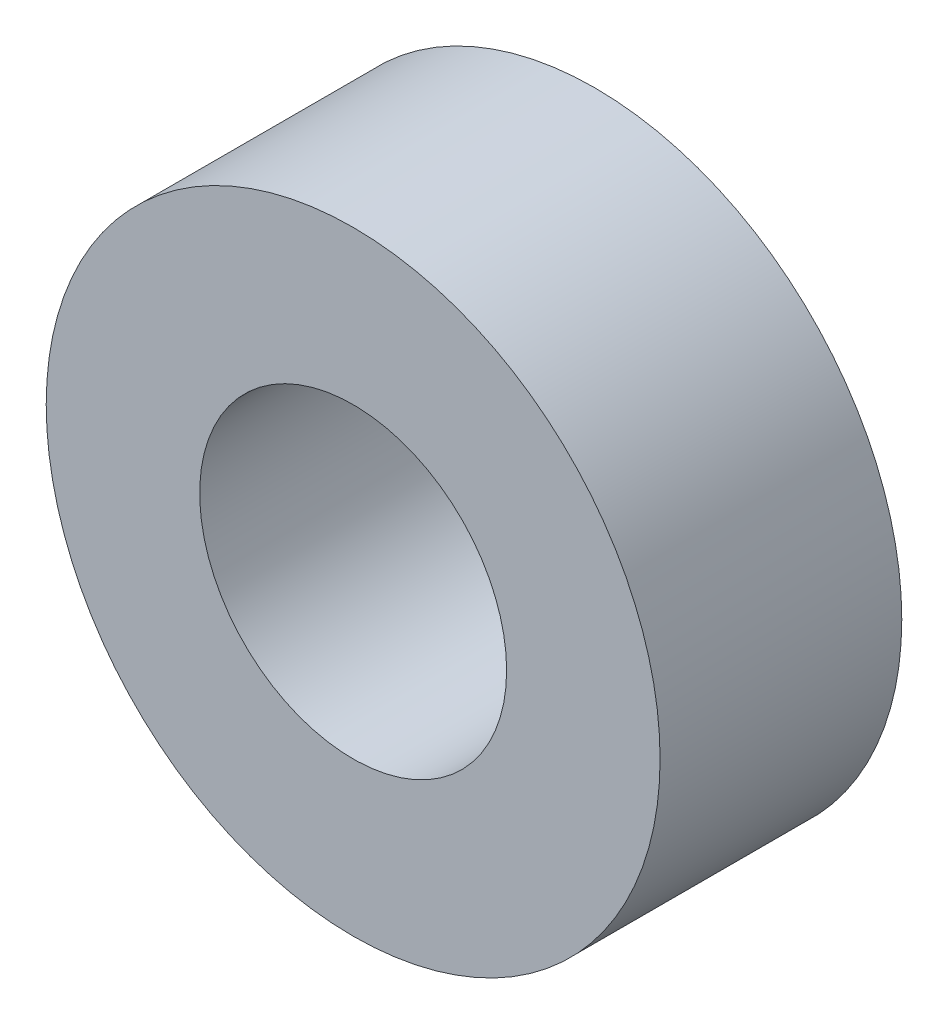
ISO-10303-21;
HEADER;
FILE_DESCRIPTION(('STEP AP214'),'2;1');
FILE_NAME('part.step','',(''),(''),'','','');
FILE_SCHEMA(('AUTOMOTIVE_DESIGN { 1 0 10303 214 1 1 1 1 }'));
ENDSEC;
DATA;
#1=APPLICATION_CONTEXT('core data for automotive mechanical design processes');
#2=APPLICATION_PROTOCOL_DEFINITION('international standard','automotive_design',2000,#1);
#3=PRODUCT_CONTEXT('',#1,'mechanical');
#4=PRODUCT('Part','Part','',(#3));
#5=PRODUCT_RELATED_PRODUCT_CATEGORY('part','',(#4));
#6=PRODUCT_DEFINITION_FORMATION('','',#4);
#7=PRODUCT_DEFINITION_CONTEXT('part definition',#1,'design');
#8=PRODUCT_DEFINITION('design','',#6,#7);
#9=PRODUCT_DEFINITION_SHAPE('','',#8);
#10=(LENGTH_UNIT() NAMED_UNIT(*) SI_UNIT(.MILLI.,.METRE.));
#11=(NAMED_UNIT(*) PLANE_ANGLE_UNIT() SI_UNIT($,.RADIAN.));
#12=(NAMED_UNIT(*) SI_UNIT($,.STERADIAN.) SOLID_ANGLE_UNIT());
#13=UNCERTAINTY_MEASURE_WITH_UNIT(LENGTH_MEASURE(1.E-05),#10,'distance_accuracy_value','');
#14=(GEOMETRIC_REPRESENTATION_CONTEXT(3) GLOBAL_UNCERTAINTY_ASSIGNED_CONTEXT((#13)) GLOBAL_UNIT_ASSIGNED_CONTEXT((#10,
#11,#12)) REPRESENTATION_CONTEXT('',''));
#15=CARTESIAN_POINT('',(0.,0.,0.));
#16=DIRECTION('',(0.,0.,1.));
#17=DIRECTION('',(1.,0.,0.));
#18=AXIS2_PLACEMENT_3D('',#15,#16,#17);
#19=CARTESIAN_POINT('',(0.,0.,5.));
#20=DIRECTION('',(0.,0.,1.));
#21=DIRECTION('',(1.,0.,0.));
#22=AXIS2_PLACEMENT_3D('',#19,#20,#21);
#23=PLANE('',#22);
#24=CARTESIAN_POINT('',(0.,0.,5.));
#25=DIRECTION('',(0.,0.,1.));
#26=DIRECTION('',(1.,0.,0.));
#27=AXIS2_PLACEMENT_3D('',#24,#25,#26);
#28=CIRCLE('',#27,6.35);
#29=CARTESIAN_POINT('',(6.35,0.,5.));
#30=VERTEX_POINT('',#29);
#31=EDGE_CURVE('E10',#30,#30,#28,.T.);
#32=ORIENTED_EDGE('',*,*,#31,.T.);
#33=EDGE_LOOP('',(#32));
#34=FACE_BOUND('',#33,.T.);
#35=CARTESIAN_POINT('',(0.,0.,5.));
#36=DIRECTION('',(0.,0.,1.));
#37=DIRECTION('',(1.,0.,0.));
#38=AXIS2_PLACEMENT_3D('',#35,#36,#37);
#39=CIRCLE('',#38,3.175);
#40=CARTESIAN_POINT('',(3.175,0.,5.));
#41=VERTEX_POINT('',#40);
#42=EDGE_CURVE('E42',#41,#41,#39,.T.);
#43=ORIENTED_EDGE('',*,*,#42,.F.);
#44=EDGE_LOOP('',(#43));
#45=FACE_BOUND('',#44,.T.);
#46=ADVANCED_FACE('F31',(#34,#45),#23,.T.);
#47=CARTESIAN_POINT('',(0.,0.,0.));
#48=DIRECTION('',(0.,0.,1.));
#49=DIRECTION('',(1.,0.,0.));
#50=AXIS2_PLACEMENT_3D('',#47,#48,#49);
#51=PLANE('',#50);
#52=CARTESIAN_POINT('',(0.,0.,0.));
#53=DIRECTION('',(0.,0.,1.));
#54=DIRECTION('',(1.,0.,0.));
#55=AXIS2_PLACEMENT_3D('',#52,#53,#54);
#56=CIRCLE('',#55,6.35);
#57=CARTESIAN_POINT('',(6.35,0.,0.));
#58=VERTEX_POINT('',#57);
#59=EDGE_CURVE('E35',#58,#58,#56,.T.);
#60=ORIENTED_EDGE('',*,*,#59,.F.);
#61=EDGE_LOOP('',(#60));
#62=FACE_BOUND('',#61,.T.);
#63=CARTESIAN_POINT('',(0.,0.,0.));
#64=DIRECTION('',(0.,0.,1.));
#65=DIRECTION('',(1.,0.,0.));
#66=AXIS2_PLACEMENT_3D('',#63,#64,#65);
#67=CIRCLE('',#66,3.175);
#68=CARTESIAN_POINT('',(3.175,0.,0.));
#69=VERTEX_POINT('',#68);
#70=EDGE_CURVE('E44',#69,#69,#67,.T.);
#71=ORIENTED_EDGE('',*,*,#70,.T.);
#72=EDGE_LOOP('',(#71));
#73=FACE_BOUND('',#72,.T.);
#74=ADVANCED_FACE('F54',(#62,#73),#51,.F.);
#75=CARTESIAN_POINT('',(0.,0.,5.));
#76=DIRECTION('',(0.,0.,-1.));
#77=DIRECTION('',(-1.,0.,0.));
#78=AXIS2_PLACEMENT_3D('',#75,#76,#77);
#79=CYLINDRICAL_SURFACE('',#78,6.35);
#80=ORIENTED_EDGE('',*,*,#31,.F.);
#81=EDGE_LOOP('',(#80));
#82=FACE_BOUND('',#81,.T.);
#83=ORIENTED_EDGE('',*,*,#59,.T.);
#84=EDGE_LOOP('',(#83));
#85=FACE_BOUND('',#84,.T.);
#86=ADVANCED_FACE('F33',(#82,#85),#79,.T.);
#87=CARTESIAN_POINT('',(0.,0.,5.));
#88=DIRECTION('',(0.,0.,-1.));
#89=DIRECTION('',(-1.,0.,0.));
#90=AXIS2_PLACEMENT_3D('',#87,#88,#89);
#91=CYLINDRICAL_SURFACE('',#90,3.175);
#92=ORIENTED_EDGE('',*,*,#42,.T.);
#93=EDGE_LOOP('',(#92));
#94=FACE_BOUND('',#93,.T.);
#95=ORIENTED_EDGE('',*,*,#70,.F.);
#96=EDGE_LOOP('',(#95));
#97=FACE_BOUND('',#96,.T.);
#98=ADVANCED_FACE('F50',(#94,#97),#91,.F.);
#99=CLOSED_SHELL('',(#46,#74,#86,#98));
#100=MANIFOLD_SOLID_BREP('B2',#99);
#101=ADVANCED_BREP_SHAPE_REPRESENTATION('',(#18,#100),#14);
#102=SHAPE_DEFINITION_REPRESENTATION(#9,#101);
ENDSEC;
END-ISO-10303-21;
